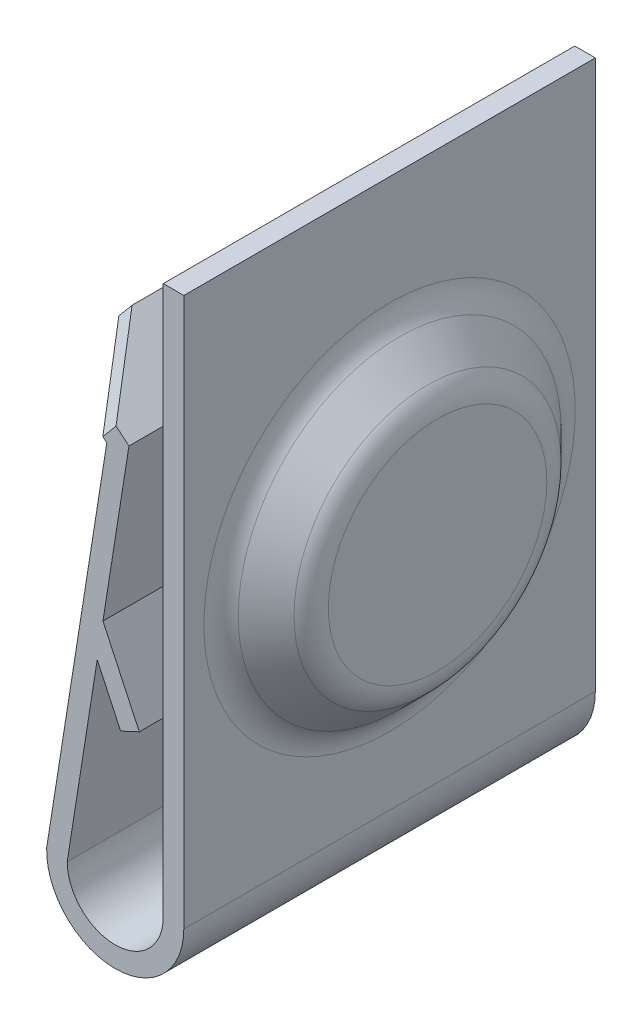
ISO-10303-21;
HEADER;
FILE_DESCRIPTION(('STEP AP214'),'2;1');
FILE_NAME('part.step','',(''),(''),'','','');
FILE_SCHEMA(('AUTOMOTIVE_DESIGN { 1 0 10303 214 1 1 1 1 }'));
ENDSEC;
DATA;
#1=APPLICATION_CONTEXT('core data for automotive mechanical design processes');
#2=APPLICATION_PROTOCOL_DEFINITION('international standard','automotive_design',2000,#1);
#3=PRODUCT_CONTEXT('',#1,'mechanical');
#4=PRODUCT('Part','Part','',(#3));
#5=PRODUCT_RELATED_PRODUCT_CATEGORY('part','',(#4));
#6=PRODUCT_DEFINITION_FORMATION('','',#4);
#7=PRODUCT_DEFINITION_CONTEXT('part definition',#1,'design');
#8=PRODUCT_DEFINITION('design','',#6,#7);
#9=PRODUCT_DEFINITION_SHAPE('','',#8);
#10=(LENGTH_UNIT() NAMED_UNIT(*) SI_UNIT(.MILLI.,.METRE.));
#11=(NAMED_UNIT(*) PLANE_ANGLE_UNIT() SI_UNIT($,.RADIAN.));
#12=(NAMED_UNIT(*) SI_UNIT($,.STERADIAN.) SOLID_ANGLE_UNIT());
#13=UNCERTAINTY_MEASURE_WITH_UNIT(LENGTH_MEASURE(1.E-05),#10,'distance_accuracy_value','');
#14=(GEOMETRIC_REPRESENTATION_CONTEXT(3) GLOBAL_UNCERTAINTY_ASSIGNED_CONTEXT((#13)) GLOBAL_UNIT_ASSIGNED_CONTEXT((#10,
#11,#12)) REPRESENTATION_CONTEXT('',''));
#15=CARTESIAN_POINT('',(0.,0.,0.));
#16=DIRECTION('',(0.,0.,1.));
#17=DIRECTION('',(1.,0.,0.));
#18=AXIS2_PLACEMENT_3D('',#15,#16,#17);
#19=CARTESIAN_POINT('',(-0.133513513513514,0.0210810810810812,6.));
#20=DIRECTION('',(-0.987762965329069,0.155962573473011,0.));
#21=DIRECTION('',(-0.155962573473011,-0.987762965329069,0.));
#22=AXIS2_PLACEMENT_3D('',#19,#20,#21);
#23=PLANE('',#22);
#24=DIRECTION('',(0.,0.,1.));
#25=VECTOR('',#24,1.);
#26=CARTESIAN_POINT('',(-0.962606384425692,-5.22984043469605,5.));
#27=LINE('',#26,#25);
#28=CARTESIAN_POINT('',(-0.962606384425692,-5.22984043469605,5.));
#29=VERTEX_POINT('',#28);
#30=CARTESIAN_POINT('',(-0.962606384425692,-5.22984043469605,6.));
#31=VERTEX_POINT('',#30);
#32=EDGE_CURVE('E203',#29,#31,#27,.T.);
#33=ORIENTED_EDGE('',*,*,#32,.T.);
#34=DIRECTION('',(0.155962573473011,0.987762965329069,0.));
#35=VECTOR('',#34,1.);
#36=CARTESIAN_POINT('',(-0.133513513513514,0.0210810810810812,6.));
#37=LINE('',#36,#35);
#38=CARTESIAN_POINT('',(-1.4,-8.,6.));
#39=VERTEX_POINT('',#38);
#40=EDGE_CURVE('E295',#39,#31,#37,.T.);
#41=ORIENTED_EDGE('',*,*,#40,.F.);
#42=DIRECTION('',(0.,0.,-1.));
#43=VECTOR('',#42,1.);
#44=CARTESIAN_POINT('',(-1.4,-8.,6.));
#45=LINE('',#44,#43);
#46=CARTESIAN_POINT('',(-1.4,-8.,0.));
#47=VERTEX_POINT('',#46);
#48=EDGE_CURVE('E360',#39,#47,#45,.T.);
#49=ORIENTED_EDGE('',*,*,#48,.T.);
#50=DIRECTION('',(0.155962573473011,0.987762965329069,0.));
#51=VECTOR('',#50,1.);
#52=CARTESIAN_POINT('',(-0.133513513513514,0.0210810810810812,0.));
#53=LINE('',#52,#51);
#54=CARTESIAN_POINT('',(-0.962606384425691,-5.22984043469604,0.));
#55=VERTEX_POINT('',#54);
#56=EDGE_CURVE('E329',#47,#55,#53,.T.);
#57=ORIENTED_EDGE('',*,*,#56,.T.);
#58=DIRECTION('',(0.,0.,-1.));
#59=VECTOR('',#58,1.);
#60=CARTESIAN_POINT('',(-0.962606384425691,-5.22984043469604,1.));
#61=LINE('',#60,#59);
#62=CARTESIAN_POINT('',(-0.962606384425691,-5.22984043469604,1.));
#63=VERTEX_POINT('',#62);
#64=EDGE_CURVE('E263',#63,#55,#61,.T.);
#65=ORIENTED_EDGE('',*,*,#64,.F.);
#66=DIRECTION('',(0.155962573473011,0.987762965329069,0.));
#67=VECTOR('',#66,1.);
#68=CARTESIAN_POINT('',(-0.133513513513514,0.0210810810810812,1.));
#69=LINE('',#68,#67);
#70=CARTESIAN_POINT('',(-0.878934414070741,-4.69991795578136,1.));
#71=VERTEX_POINT('',#70);
#72=EDGE_CURVE('E73',#63,#71,#69,.T.);
#73=ORIENTED_EDGE('',*,*,#72,.T.);
#74=DIRECTION('',(0.,0.,-1.));
#75=VECTOR('',#74,1.);
#76=CARTESIAN_POINT('',(-0.87893441407074,-4.69991795578136,1.));
#77=LINE('',#76,#75);
#78=CARTESIAN_POINT('',(-0.87893441407074,-4.69991795578136,0.));
#79=VERTEX_POINT('',#78);
#80=EDGE_CURVE('E267',#71,#79,#77,.T.);
#81=ORIENTED_EDGE('',*,*,#80,.T.);
#82=CARTESIAN_POINT('',(-0.5,-2.3,0.));
#83=VERTEX_POINT('',#82);
#84=EDGE_CURVE('E328',#79,#83,#53,.T.);
#85=ORIENTED_EDGE('',*,*,#84,.T.);
#86=DIRECTION('',(0.,0.,-1.));
#87=VECTOR('',#86,1.);
#88=CARTESIAN_POINT('',(-0.5,-2.3,6.));
#89=LINE('',#88,#87);
#90=CARTESIAN_POINT('',(-0.5,-2.3,6.));
#91=VERTEX_POINT('',#90);
#92=EDGE_CURVE('E356',#91,#83,#89,.T.);
#93=ORIENTED_EDGE('',*,*,#92,.F.);
#94=CARTESIAN_POINT('',(-0.87893441407074,-4.69991795578136,6.));
#95=VERTEX_POINT('',#94);
#96=EDGE_CURVE('E294',#95,#91,#37,.T.);
#97=ORIENTED_EDGE('',*,*,#96,.F.);
#98=DIRECTION('',(0.,0.,1.));
#99=VECTOR('',#98,1.);
#100=CARTESIAN_POINT('',(-0.87893441407074,-4.69991795578136,5.));
#101=LINE('',#100,#99);
#102=CARTESIAN_POINT('',(-0.87893441407074,-4.69991795578136,5.));
#103=VERTEX_POINT('',#102);
#104=EDGE_CURVE('E211',#103,#95,#101,.T.);
#105=ORIENTED_EDGE('',*,*,#104,.F.);
#106=DIRECTION('',(-0.155962573473011,-0.987762965329069,0.));
#107=VECTOR('',#106,1.);
#108=CARTESIAN_POINT('',(-0.133513513513514,0.0210810810810812,5.));
#109=LINE('',#108,#107);
#110=EDGE_CURVE('E192',#103,#29,#109,.T.);
#111=ORIENTED_EDGE('',*,*,#110,.T.);
#112=EDGE_LOOP('',(#33,#41,#49,#57,#65,#73,#81,#85,#93,#97,#105,#111));
#113=FACE_BOUND('',#112,.T.);
#114=ADVANCED_FACE('F49',(#113),#23,.F.);
#115=CARTESIAN_POINT('',(-0.699999999999999,-8.,6.));
#116=DIRECTION('',(0.,0.,-1.));
#117=DIRECTION('',(-1.,0.,0.));
#118=AXIS2_PLACEMENT_3D('',#115,#116,#117);
#119=CYLINDRICAL_SURFACE('',#118,0.999999999999999);
#120=CARTESIAN_POINT('',(-0.699999999999999,-8.,0.));
#121=DIRECTION('',(0.,0.,1.));
#122=DIRECTION('',(1.,0.,0.));
#123=AXIS2_PLACEMENT_3D('',#120,#121,#122);
#124=CIRCLE('',#123,0.999999999999999);
#125=CARTESIAN_POINT('',(0.3,-8.,0.));
#126=VERTEX_POINT('',#125);
#127=CARTESIAN_POINT('',(-1.69967183658794,-7.97438322555649,0.));
#128=VERTEX_POINT('',#127);
#129=EDGE_CURVE('E274',#126,#128,#124,.F.);
#130=ORIENTED_EDGE('',*,*,#129,.F.);
#131=DIRECTION('',(0.,0.,-1.));
#132=VECTOR('',#131,1.);
#133=CARTESIAN_POINT('',(0.3,-8.,6.));
#134=LINE('',#133,#132);
#135=CARTESIAN_POINT('',(0.3,-8.,6.));
#136=VERTEX_POINT('',#135);
#137=EDGE_CURVE('E374',#136,#126,#134,.T.);
#138=ORIENTED_EDGE('',*,*,#137,.F.);
#139=CARTESIAN_POINT('',(-0.699999999999999,-8.,6.));
#140=DIRECTION('',(0.,0.,1.));
#141=DIRECTION('',(1.,0.,0.));
#142=AXIS2_PLACEMENT_3D('',#139,#140,#141);
#143=CIRCLE('',#142,0.999999999999999);
#144=CARTESIAN_POINT('',(-1.69967183658794,-7.97438322555649,6.));
#145=VERTEX_POINT('',#144);
#146=EDGE_CURVE('E275',#136,#145,#143,.F.);
#147=ORIENTED_EDGE('',*,*,#146,.T.);
#148=DIRECTION('',(0.,0.,-1.));
#149=VECTOR('',#148,1.);
#150=CARTESIAN_POINT('',(-1.69967183658794,-7.97438322555649,6.));
#151=LINE('',#150,#149);
#152=EDGE_CURVE('E310',#145,#128,#151,.T.);
#153=ORIENTED_EDGE('',*,*,#152,.T.);
#154=EDGE_LOOP('',(#130,#138,#147,#153));
#155=FACE_BOUND('',#154,.T.);
#156=ADVANCED_FACE('F426',(#155),#119,.T.);
#157=CARTESIAN_POINT('',(0.3,0.,6.));
#158=DIRECTION('',(1.,0.,0.));
#159=DIRECTION('',(0.,0.,-1.));
#160=AXIS2_PLACEMENT_3D('',#157,#158,#159);
#161=PLANE('',#160);
#162=CARTESIAN_POINT('',(0.3,-4.3,3.));
#163=DIRECTION('',(1.,0.,0.));
#164=DIRECTION('',(0.,0.,-1.));
#165=AXIS2_PLACEMENT_3D('',#162,#163,#164);
#166=CIRCLE('',#165,2.70710678118656);
#167=CARTESIAN_POINT('',(0.3,-4.3,0.292893218813443));
#168=VERTEX_POINT('',#167);
#169=EDGE_CURVE('E403',#168,#168,#166,.F.);
#170=ORIENTED_EDGE('',*,*,#169,.T.);
#171=EDGE_LOOP('',(#170));
#172=FACE_BOUND('',#171,.T.);
#173=DIRECTION('',(0.,-1.,0.));
#174=VECTOR('',#173,1.);
#175=CARTESIAN_POINT('',(0.3,0.,0.));
#176=LINE('',#175,#174);
#177=CARTESIAN_POINT('',(0.3,0.,0.));
#178=VERTEX_POINT('',#177);
#179=EDGE_CURVE('E314',#178,#126,#176,.T.);
#180=ORIENTED_EDGE('',*,*,#179,.F.);
#181=DIRECTION('',(0.,0.,-1.));
#182=VECTOR('',#181,1.);
#183=CARTESIAN_POINT('',(0.3,0.,6.));
#184=LINE('',#183,#182);
#185=CARTESIAN_POINT('',(0.3,0.,6.));
#186=VERTEX_POINT('',#185);
#187=EDGE_CURVE('E371',#186,#178,#184,.T.);
#188=ORIENTED_EDGE('',*,*,#187,.F.);
#189=DIRECTION('',(0.,-1.,0.));
#190=VECTOR('',#189,1.);
#191=CARTESIAN_POINT('',(0.3,0.,6.));
#192=LINE('',#191,#190);
#193=EDGE_CURVE('E279',#186,#136,#192,.T.);
#194=ORIENTED_EDGE('',*,*,#193,.T.);
#195=ORIENTED_EDGE('',*,*,#137,.T.);
#196=EDGE_LOOP('',(#180,#188,#194,#195));
#197=FACE_BOUND('',#196,.T.);
#198=ADVANCED_FACE('F422',(#172,#197),#161,.T.);
#199=CARTESIAN_POINT('',(0.,0.,6.));
#200=DIRECTION('',(0.,1.,0.));
#201=DIRECTION('',(0.,0.,1.));
#202=AXIS2_PLACEMENT_3D('',#199,#200,#201);
#203=PLANE('',#202);
#204=DIRECTION('',(1.,0.,0.));
#205=VECTOR('',#204,1.);
#206=CARTESIAN_POINT('',(0.,0.,0.));
#207=LINE('',#206,#205);
#208=CARTESIAN_POINT('',(0.,0.,0.));
#209=VERTEX_POINT('',#208);
#210=EDGE_CURVE('E318',#209,#178,#207,.T.);
#211=ORIENTED_EDGE('',*,*,#210,.F.);
#212=DIRECTION('',(0.,0.,-1.));
#213=VECTOR('',#212,1.);
#214=CARTESIAN_POINT('',(0.,0.,6.));
#215=LINE('',#214,#213);
#216=CARTESIAN_POINT('',(0.,0.,6.));
#217=VERTEX_POINT('',#216);
#218=EDGE_CURVE('E368',#217,#209,#215,.T.);
#219=ORIENTED_EDGE('',*,*,#218,.F.);
#220=DIRECTION('',(1.,0.,0.));
#221=VECTOR('',#220,1.);
#222=CARTESIAN_POINT('',(0.,0.,6.));
#223=LINE('',#222,#221);
#224=EDGE_CURVE('E284',#217,#186,#223,.T.);
#225=ORIENTED_EDGE('',*,*,#224,.T.);
#226=ORIENTED_EDGE('',*,*,#187,.T.);
#227=EDGE_LOOP('',(#211,#219,#225,#226));
#228=FACE_BOUND('',#227,.T.);
#229=ADVANCED_FACE('F425',(#228),#203,.T.);
#230=CARTESIAN_POINT('',(0.,0.,6.));
#231=DIRECTION('',(1.,0.,0.));
#232=DIRECTION('',(0.,1.,0.));
#233=AXIS2_PLACEMENT_3D('',#230,#231,#232);
#234=PLANE('',#233);
#235=DIRECTION('',(0.,-1.,0.));
#236=VECTOR('',#235,1.);
#237=CARTESIAN_POINT('',(0.,0.,0.));
#238=LINE('',#237,#236);
#239=CARTESIAN_POINT('',(0.,-8.,0.));
#240=VERTEX_POINT('',#239);
#241=EDGE_CURVE('E322',#209,#240,#238,.T.);
#242=ORIENTED_EDGE('',*,*,#241,.T.);
#243=DIRECTION('',(0.,0.,-1.));
#244=VECTOR('',#243,1.);
#245=CARTESIAN_POINT('',(0.,-8.,6.));
#246=LINE('',#245,#244);
#247=CARTESIAN_POINT('',(0.,-8.,6.));
#248=VERTEX_POINT('',#247);
#249=EDGE_CURVE('E364',#248,#240,#246,.T.);
#250=ORIENTED_EDGE('',*,*,#249,.F.);
#251=DIRECTION('',(0.,-1.,0.));
#252=VECTOR('',#251,1.);
#253=CARTESIAN_POINT('',(0.,0.,6.));
#254=LINE('',#253,#252);
#255=EDGE_CURVE('E288',#217,#248,#254,.T.);
#256=ORIENTED_EDGE('',*,*,#255,.F.);
#257=ORIENTED_EDGE('',*,*,#218,.T.);
#258=EDGE_LOOP('',(#242,#250,#256,#257));
#259=FACE_BOUND('',#258,.T.);
#260=ADVANCED_FACE('F491',(#259),#234,.F.);
#261=CARTESIAN_POINT('',(-0.7,-8.,6.));
#262=DIRECTION('',(0.,0.,-1.));
#263=DIRECTION('',(-1.,0.,0.));
#264=AXIS2_PLACEMENT_3D('',#261,#262,#263);
#265=CYLINDRICAL_SURFACE('',#264,0.7);
#266=CARTESIAN_POINT('',(-0.7,-8.,0.));
#267=DIRECTION('',(0.,0.,1.));
#268=DIRECTION('',(1.,0.,0.));
#269=AXIS2_PLACEMENT_3D('',#266,#267,#268);
#270=CIRCLE('',#269,0.7);
#271=EDGE_CURVE('E325',#240,#47,#270,.F.);
#272=ORIENTED_EDGE('',*,*,#271,.T.);
#273=ORIENTED_EDGE('',*,*,#48,.F.);
#274=CARTESIAN_POINT('',(-0.7,-8.,6.));
#275=DIRECTION('',(0.,0.,1.));
#276=DIRECTION('',(1.,0.,0.));
#277=AXIS2_PLACEMENT_3D('',#274,#275,#276);
#278=CIRCLE('',#277,0.7);
#279=EDGE_CURVE('E291',#248,#39,#278,.F.);
#280=ORIENTED_EDGE('',*,*,#279,.F.);
#281=ORIENTED_EDGE('',*,*,#249,.T.);
#282=EDGE_LOOP('',(#272,#273,#280,#281));
#283=FACE_BOUND('',#282,.T.);
#284=ADVANCED_FACE('F489',(#283),#265,.F.);
#285=CARTESIAN_POINT('',(-1.33869031443741,-1.59693780244029,6.));
#286=DIRECTION('',(-0.642421554244944,-0.766351451125077,0.));
#287=DIRECTION('',(0.766351451125077,-0.642421554244944,0.));
#288=AXIS2_PLACEMENT_3D('',#285,#286,#287);
#289=PLANE('',#288);
#290=DIRECTION('',(-0.766351451125077,0.642421554244944,0.));
#291=VECTOR('',#290,1.);
#292=CARTESIAN_POINT('',(-1.33869031443741,-1.59693780244029,0.));
#293=LINE('',#292,#291);
#294=CARTESIAN_POINT('',(-0.687976990766372,-2.14242155424494,0.));
#295=VERTEX_POINT('',#294);
#296=EDGE_CURVE('E332',#83,#295,#293,.T.);
#297=ORIENTED_EDGE('',*,*,#296,.T.);
#298=DIRECTION('',(0.541892307862694,-0.454260637387002,-0.707106781186546));
#299=VECTOR('',#298,1.);
#300=CARTESIAN_POINT('',(-1.45432844189145,-1.5,1.));
#301=LINE('',#300,#299);
#302=CARTESIAN_POINT('',(-1.45432844189145,-1.5,1.));
#303=VERTEX_POINT('',#302);
#304=EDGE_CURVE('E396',#295,#303,#301,.F.);
#305=ORIENTED_EDGE('',*,*,#304,.T.);
#306=DIRECTION('',(0.,0.,-1.));
#307=VECTOR('',#306,1.);
#308=CARTESIAN_POINT('',(-1.45432844189145,-1.5,6.));
#309=LINE('',#308,#307);
#310=CARTESIAN_POINT('',(-1.45432844189145,-1.5,5.));
#311=VERTEX_POINT('',#310);
#312=EDGE_CURVE('E352',#311,#303,#309,.T.);
#313=ORIENTED_EDGE('',*,*,#312,.F.);
#314=DIRECTION('',(0.541892307862692,-0.454260637387001,0.707106781186549));
#315=VECTOR('',#314,1.);
#316=CARTESIAN_POINT('',(-0.687976990766374,-2.14242155424494,6.));
#317=LINE('',#316,#315);
#318=CARTESIAN_POINT('',(-0.687976990766374,-2.14242155424494,6.));
#319=VERTEX_POINT('',#318);
#320=EDGE_CURVE('E393',#311,#319,#317,.T.);
#321=ORIENTED_EDGE('',*,*,#320,.T.);
#322=DIRECTION('',(-0.766351451125077,0.642421554244944,0.));
#323=VECTOR('',#322,1.);
#324=CARTESIAN_POINT('',(-1.33869031443741,-1.59693780244029,6.));
#325=LINE('',#324,#323);
#326=EDGE_CURVE('E298',#91,#319,#325,.T.);
#327=ORIENTED_EDGE('',*,*,#326,.F.);
#328=ORIENTED_EDGE('',*,*,#92,.T.);
#329=EDGE_LOOP('',(#297,#305,#313,#321,#327,#328));
#330=FACE_BOUND('',#329,.T.);
#331=ADVANCED_FACE('F459',(#330),#289,.F.);
#332=CARTESIAN_POINT('',(-0.115638127454037,0.0969378024402965,6.));
#333=DIRECTION('',(0.766351451125077,-0.642421554244943,0.));
#334=DIRECTION('',(0.642421554244943,0.766351451125077,0.));
#335=AXIS2_PLACEMENT_3D('',#332,#333,#334);
#336=PLANE('',#335);
#337=ORIENTED_EDGE('',*,*,#312,.T.);
#338=DIRECTION('',(-0.642421554244943,-0.766351451125077,0.));
#339=VECTOR('',#338,1.);
#340=CARTESIAN_POINT('',(-0.115638127454037,0.0969378024402965,1.));
#341=LINE('',#340,#339);
#342=CARTESIAN_POINT('',(-1.64705490816493,-1.72990543533752,1.));
#343=VERTEX_POINT('',#342);
#344=EDGE_CURVE('E380',#303,#343,#341,.T.);
#345=ORIENTED_EDGE('',*,*,#344,.T.);
#346=DIRECTION('',(0.,0.,-1.));
#347=VECTOR('',#346,1.);
#348=CARTESIAN_POINT('',(-1.64705490816493,-1.72990543533752,6.));
#349=LINE('',#348,#347);
#350=CARTESIAN_POINT('',(-1.64705490816493,-1.72990543533752,5.));
#351=VERTEX_POINT('',#350);
#352=EDGE_CURVE('E348',#351,#343,#349,.T.);
#353=ORIENTED_EDGE('',*,*,#352,.F.);
#354=DIRECTION('',(0.642421554244943,0.766351451125077,0.));
#355=VECTOR('',#354,1.);
#356=CARTESIAN_POINT('',(-1.45432844189145,-1.5,5.));
#357=LINE('',#356,#355);
#358=EDGE_CURVE('E377',#351,#311,#357,.T.);
#359=ORIENTED_EDGE('',*,*,#358,.T.);
#360=EDGE_LOOP('',(#337,#345,#353,#359));
#361=FACE_BOUND('',#360,.T.);
#362=ADVANCED_FACE('F462',(#361),#336,.F.);
#363=CARTESIAN_POINT('',(-1.5314167807109,-1.82684323777782,6.));
#364=DIRECTION('',(-0.642421554244943,-0.766351451125077,0.));
#365=DIRECTION('',(0.766351451125077,-0.642421554244944,0.));
#366=AXIS2_PLACEMENT_3D('',#363,#364,#365);
#367=PLANE('',#366);
#368=ORIENTED_EDGE('',*,*,#352,.T.);
#369=DIRECTION('',(-0.541892307862694,0.454260637387002,0.707106781186546));
#370=VECTOR('',#369,1.);
#371=CARTESIAN_POINT('',(-3.50511447225061,-0.17232045094531,3.42455280975571));
#372=LINE('',#371,#370);
#373=CARTESIAN_POINT('',(-0.880703457039855,-2.37232698958247,0.));
#374=VERTEX_POINT('',#373);
#375=EDGE_CURVE('E387',#343,#374,#372,.F.);
#376=ORIENTED_EDGE('',*,*,#375,.T.);
#377=DIRECTION('',(-0.766351451125077,0.642421554244944,0.));
#378=VECTOR('',#377,1.);
#379=CARTESIAN_POINT('',(-1.5314167807109,-1.82684323777782,0.));
#380=LINE('',#379,#378);
#381=CARTESIAN_POINT('',(-0.822800703144863,-2.42086604708366,0.));
#382=VERTEX_POINT('',#381);
#383=EDGE_CURVE('E336',#382,#374,#380,.T.);
#384=ORIENTED_EDGE('',*,*,#383,.F.);
#385=DIRECTION('',(0.,0.,-1.));
#386=VECTOR('',#385,1.);
#387=CARTESIAN_POINT('',(-0.822800703144863,-2.42086604708366,6.));
#388=LINE('',#387,#386);
#389=CARTESIAN_POINT('',(-0.822800703144863,-2.42086604708366,6.));
#390=VERTEX_POINT('',#389);
#391=EDGE_CURVE('E345',#390,#382,#388,.T.);
#392=ORIENTED_EDGE('',*,*,#391,.F.);
#393=DIRECTION('',(-0.766351451125077,0.642421554244944,0.));
#394=VECTOR('',#393,1.);
#395=CARTESIAN_POINT('',(-1.5314167807109,-1.82684323777782,6.));
#396=LINE('',#395,#394);
#397=CARTESIAN_POINT('',(-0.880703457039856,-2.37232698958246,6.));
#398=VERTEX_POINT('',#397);
#399=EDGE_CURVE('E302',#390,#398,#396,.T.);
#400=ORIENTED_EDGE('',*,*,#399,.T.);
#401=DIRECTION('',(-0.541892307862692,0.454260637387,-0.707106781186549));
#402=VECTOR('',#401,1.);
#403=CARTESIAN_POINT('',(-1.20606011887538,-2.09958511368014,5.57544719024429));
#404=LINE('',#403,#402);
#405=EDGE_CURVE('E384',#398,#351,#404,.T.);
#406=ORIENTED_EDGE('',*,*,#405,.T.);
#407=EDGE_LOOP('',(#368,#376,#384,#392,#400,#406));
#408=FACE_BOUND('',#407,.T.);
#409=ADVANCED_FACE('F450',(#408),#367,.T.);
#410=CARTESIAN_POINT('',(-0.429842403112235,0.0678698531229845,6.));
#411=DIRECTION('',(-0.987762965329069,0.155962573473011,0.));
#412=DIRECTION('',(-0.155962573473011,-0.987762965329069,0.));
#413=AXIS2_PLACEMENT_3D('',#410,#411,#412);
#414=PLANE('',#413);
#415=DIRECTION('',(0.155962573473011,0.987762965329069,0.));
#416=VECTOR('',#415,1.);
#417=CARTESIAN_POINT('',(-0.429842403112235,0.0678698531229845,0.));
#418=LINE('',#417,#416);
#419=EDGE_CURVE('E280',#128,#382,#418,.T.);
#420=ORIENTED_EDGE('',*,*,#419,.F.);
#421=ORIENTED_EDGE('',*,*,#152,.F.);
#422=DIRECTION('',(0.155962573473011,0.987762965329069,0.));
#423=VECTOR('',#422,1.);
#424=CARTESIAN_POINT('',(-0.429842403112235,0.0678698531229845,6.));
#425=LINE('',#424,#423);
#426=EDGE_CURVE('E306',#145,#390,#425,.T.);
#427=ORIENTED_EDGE('',*,*,#426,.T.);
#428=ORIENTED_EDGE('',*,*,#391,.T.);
#429=EDGE_LOOP('',(#420,#421,#427,#428));
#430=FACE_BOUND('',#429,.T.);
#431=ADVANCED_FACE('F447',(#430),#414,.T.);
#432=CARTESIAN_POINT('',(0.,0.,6.));
#433=DIRECTION('',(0.,0.,1.));
#434=DIRECTION('',(1.,0.,0.));
#435=AXIS2_PLACEMENT_3D('',#432,#433,#434);
#436=PLANE('',#435);
#437=ORIENTED_EDGE('',*,*,#326,.T.);
#438=DIRECTION('',(-0.642421554244943,-0.766351451125077,0.));
#439=VECTOR('',#438,1.);
#440=CARTESIAN_POINT('',(-0.880703457039857,-2.37232698958246,6.));
#441=LINE('',#440,#439);
#442=EDGE_CURVE('E399',#319,#398,#441,.T.);
#443=ORIENTED_EDGE('',*,*,#442,.T.);
#444=ORIENTED_EDGE('',*,*,#399,.F.);
#445=ORIENTED_EDGE('',*,*,#426,.F.);
#446=ORIENTED_EDGE('',*,*,#146,.F.);
#447=ORIENTED_EDGE('',*,*,#193,.F.);
#448=ORIENTED_EDGE('',*,*,#224,.F.);
#449=ORIENTED_EDGE('',*,*,#255,.T.);
#450=ORIENTED_EDGE('',*,*,#279,.T.);
#451=ORIENTED_EDGE('',*,*,#40,.T.);
#452=DIRECTION('',(-0.423051207201736,0.906105775329323,0.));
#453=VECTOR('',#452,1.);
#454=CARTESIAN_POINT('',(-2.79507672997063,-1.30499177582859,6.));
#455=LINE('',#454,#453);
#456=CARTESIAN_POINT('',(-0.621188887725109,-5.96110029235048,6.));
#457=VERTEX_POINT('',#456);
#458=EDGE_CURVE('E206',#457,#31,#455,.T.);
#459=ORIENTED_EDGE('',*,*,#458,.F.);
#460=DIRECTION('',(-0.906105775329324,-0.423051207201735,0.));
#461=VECTOR('',#460,1.);
#462=CARTESIAN_POINT('',(2.17388784224552,-4.65610851652189,6.));
#463=LINE('',#462,#461);
#464=CARTESIAN_POINT('',(-0.349357155126313,-5.83418493018996,6.));
#465=VERTEX_POINT('',#464);
#466=EDGE_CURVE('E200',#465,#457,#463,.T.);
#467=ORIENTED_EDGE('',*,*,#466,.F.);
#468=DIRECTION('',(0.423051207201736,-0.906105775329323,0.));
#469=VECTOR('',#468,1.);
#470=CARTESIAN_POINT('',(-2.52324499737183,-1.17807641366807,6.));
#471=LINE('',#470,#469);
#472=EDGE_CURVE('E65',#95,#465,#471,.T.);
#473=ORIENTED_EDGE('',*,*,#472,.F.);
#474=ORIENTED_EDGE('',*,*,#96,.T.);
#475=EDGE_LOOP('',(#437,#443,#444,#445,#446,#447,#448,#449,#450,#451,#459,#467,#473,#474));
#476=FACE_BOUND('',#475,.T.);
#477=ADVANCED_FACE('F439',(#476),#436,.T.);
#478=CARTESIAN_POINT('',(0.,0.,0.));
#479=DIRECTION('',(0.,0.,1.));
#480=DIRECTION('',(1.,0.,0.));
#481=AXIS2_PLACEMENT_3D('',#478,#479,#480);
#482=PLANE('',#481);
#483=ORIENTED_EDGE('',*,*,#383,.T.);
#484=DIRECTION('',(0.642421554244943,0.766351451125077,0.));
#485=VECTOR('',#484,1.);
#486=CARTESIAN_POINT('',(0.650713323671042,-0.545483751804649,0.));
#487=LINE('',#486,#485);
#488=EDGE_CURVE('E390',#374,#295,#487,.T.);
#489=ORIENTED_EDGE('',*,*,#488,.T.);
#490=ORIENTED_EDGE('',*,*,#296,.F.);
#491=ORIENTED_EDGE('',*,*,#84,.F.);
#492=DIRECTION('',(-0.423051207201736,0.906105775329323,0.));
#493=VECTOR('',#492,1.);
#494=CARTESIAN_POINT('',(-2.52324499737183,-1.17807641366807,0.));
#495=LINE('',#494,#493);
#496=CARTESIAN_POINT('',(-0.349357155126312,-5.83418493018996,0.));
#497=VERTEX_POINT('',#496);
#498=EDGE_CURVE('E254',#497,#79,#495,.T.);
#499=ORIENTED_EDGE('',*,*,#498,.F.);
#500=DIRECTION('',(0.906105775329324,0.423051207201735,0.));
#501=VECTOR('',#500,1.);
#502=CARTESIAN_POINT('',(2.17388784224552,-4.65610851652189,0.));
#503=LINE('',#502,#501);
#504=CARTESIAN_POINT('',(-0.621188887725109,-5.96110029235048,0.));
#505=VERTEX_POINT('',#504);
#506=EDGE_CURVE('E210',#505,#497,#503,.T.);
#507=ORIENTED_EDGE('',*,*,#506,.F.);
#508=DIRECTION('',(0.423051207201736,-0.906105775329323,0.));
#509=VECTOR('',#508,1.);
#510=CARTESIAN_POINT('',(-2.79507672997063,-1.30499177582859,0.));
#511=LINE('',#510,#509);
#512=EDGE_CURVE('E242',#55,#505,#511,.T.);
#513=ORIENTED_EDGE('',*,*,#512,.F.);
#514=ORIENTED_EDGE('',*,*,#56,.F.);
#515=ORIENTED_EDGE('',*,*,#271,.F.);
#516=ORIENTED_EDGE('',*,*,#241,.F.);
#517=ORIENTED_EDGE('',*,*,#210,.T.);
#518=ORIENTED_EDGE('',*,*,#179,.T.);
#519=ORIENTED_EDGE('',*,*,#129,.T.);
#520=ORIENTED_EDGE('',*,*,#419,.T.);
#521=EDGE_LOOP('',(#483,#489,#490,#491,#499,#507,#513,#514,#515,#516,#517,#518,#519,#520));
#522=FACE_BOUND('',#521,.T.);
#523=ADVANCED_FACE('F434',(#522),#482,.F.);
#524=CARTESIAN_POINT('',(-0.115638127454037,0.0969378024402965,1.));
#525=DIRECTION('',(0.541892307862692,-0.454260637387,0.707106781186549));
#526=DIRECTION('',(-0.642421554244943,-0.766351451125077,0.));
#527=AXIS2_PLACEMENT_3D('',#524,#525,#526);
#528=PLANE('',#527);
#529=ORIENTED_EDGE('',*,*,#304,.F.);
#530=ORIENTED_EDGE('',*,*,#488,.F.);
#531=ORIENTED_EDGE('',*,*,#375,.F.);
#532=ORIENTED_EDGE('',*,*,#344,.F.);
#533=EDGE_LOOP('',(#529,#530,#531,#532));
#534=FACE_BOUND('',#533,.T.);
#535=ADVANCED_FACE('F455',(#534),#528,.F.);
#536=CARTESIAN_POINT('',(0.650713323671041,-0.545483751804648,6.));
#537=DIRECTION('',(-0.541892307862694,0.454260637387002,0.707106781186546));
#538=DIRECTION('',(0.642421554244943,0.766351451125077,0.));
#539=AXIS2_PLACEMENT_3D('',#536,#537,#538);
#540=PLANE('',#539);
#541=ORIENTED_EDGE('',*,*,#320,.F.);
#542=ORIENTED_EDGE('',*,*,#358,.F.);
#543=ORIENTED_EDGE('',*,*,#405,.F.);
#544=ORIENTED_EDGE('',*,*,#442,.F.);
#545=EDGE_LOOP('',(#541,#542,#543,#544));
#546=FACE_BOUND('',#545,.T.);
#547=ADVANCED_FACE('F466',(#546),#540,.T.);
#548=CARTESIAN_POINT('',(1.,0.,0.));
#549=DIRECTION('',(1.,0.,0.));
#550=DIRECTION('',(0.,0.,-1.));
#551=AXIS2_PLACEMENT_3D('',#548,#549,#550);
#552=PLANE('',#551);
#553=CARTESIAN_POINT('',(1.,-4.3,3.));
#554=DIRECTION('',(1.,0.,0.));
#555=DIRECTION('',(0.,0.,-1.));
#556=AXIS2_PLACEMENT_3D('',#553,#554,#555);
#557=CIRCLE('',#556,1.59289321881347);
#558=CARTESIAN_POINT('',(1.,-4.3,1.40710678118653));
#559=VERTEX_POINT('',#558);
#560=EDGE_CURVE('E11',#559,#559,#557,.T.);
#561=ORIENTED_EDGE('',*,*,#560,.T.);
#562=EDGE_LOOP('',(#561));
#563=FACE_BOUND('',#562,.T.);
#564=ADVANCED_FACE('F520',(#563),#552,.T.);
#565=CARTESIAN_POINT('',(1.30000000000002,-4.3,3.));
#566=DIRECTION('',(-1.,0.,0.));
#567=DIRECTION('',(0.,0.,1.));
#568=AXIS2_PLACEMENT_3D('',#565,#566,#567);
#569=CONICAL_SURFACE('',#568,1.5,0.785398163397443);
#570=CARTESIAN_POINT('',(0.446446609406728,-4.3,3.));
#571=DIRECTION('',(1.,0.,0.));
#572=DIRECTION('',(0.,0.,-1.));
#573=AXIS2_PLACEMENT_3D('',#570,#571,#572);
#574=CIRCLE('',#573,2.35355339059328);
#575=CARTESIAN_POINT('',(0.446446609406728,-4.3,0.646446609406719));
#576=VERTEX_POINT('',#575);
#577=EDGE_CURVE('E58',#576,#576,#574,.T.);
#578=ORIENTED_EDGE('',*,*,#577,.T.);
#579=EDGE_LOOP('',(#578));
#580=FACE_BOUND('',#579,.T.);
#581=CARTESIAN_POINT('',(0.853553390593272,-4.3,3.));
#582=DIRECTION('',(-1.,0.,0.));
#583=DIRECTION('',(0.,0.,1.));
#584=AXIS2_PLACEMENT_3D('',#581,#582,#583);
#585=CIRCLE('',#584,1.94644660940674);
#586=CARTESIAN_POINT('',(0.853553390593272,-4.3,4.94644660940674));
#587=VERTEX_POINT('',#586);
#588=EDGE_CURVE('E407',#587,#587,#585,.T.);
#589=ORIENTED_EDGE('',*,*,#588,.T.);
#590=EDGE_LOOP('',(#589));
#591=FACE_BOUND('',#590,.T.);
#592=ADVANCED_FACE('F414',(#580,#591),#569,.T.);
#593=CARTESIAN_POINT('',(0.8,-4.3,3.));
#594=DIRECTION('',(1.,0.,0.));
#595=DIRECTION('',(0.,0.,-1.));
#596=AXIS2_PLACEMENT_3D('',#593,#594,#595);
#597=TOROIDAL_SURFACE('',#596,2.70710678118656,0.5);
#598=ORIENTED_EDGE('',*,*,#577,.F.);
#599=EDGE_LOOP('',(#598));
#600=FACE_BOUND('',#599,.T.);
#601=ORIENTED_EDGE('',*,*,#169,.F.);
#602=EDGE_LOOP('',(#601));
#603=FACE_BOUND('',#602,.T.);
#604=ADVANCED_FACE('F417',(#600,#603),#597,.F.);
#605=CARTESIAN_POINT('',(0.5,-4.3,3.));
#606=DIRECTION('',(1.,0.,0.));
#607=DIRECTION('',(0.,0.,-1.));
#608=AXIS2_PLACEMENT_3D('',#605,#606,#607);
#609=TOROIDAL_SURFACE('',#608,1.59289321881347,0.5);
#610=ORIENTED_EDGE('',*,*,#588,.F.);
#611=EDGE_LOOP('',(#610));
#612=FACE_BOUND('',#611,.T.);
#613=ORIENTED_EDGE('',*,*,#560,.F.);
#614=EDGE_LOOP('',(#613));
#615=FACE_BOUND('',#614,.T.);
#616=ADVANCED_FACE('F51',(#612,#615),#609,.T.);
#617=CARTESIAN_POINT('',(2.17388784224552,-4.65610851652189,1.));
#618=DIRECTION('',(-0.423051207201735,0.906105775329324,0.));
#619=DIRECTION('',(-0.906105775329324,-0.423051207201735,0.));
#620=AXIS2_PLACEMENT_3D('',#617,#618,#619);
#621=PLANE('',#620);
#622=ORIENTED_EDGE('',*,*,#506,.T.);
#623=DIRECTION('',(0.,0.,-1.));
#624=VECTOR('',#623,1.);
#625=CARTESIAN_POINT('',(-0.349357155126312,-5.83418493018996,1.));
#626=LINE('',#625,#624);
#627=CARTESIAN_POINT('',(-0.349357155126312,-5.83418493018996,1.));
#628=VERTEX_POINT('',#627);
#629=EDGE_CURVE('E270',#628,#497,#626,.T.);
#630=ORIENTED_EDGE('',*,*,#629,.F.);
#631=DIRECTION('',(0.906105775329324,0.423051207201735,0.));
#632=VECTOR('',#631,1.);
#633=CARTESIAN_POINT('',(2.17388784224552,-4.65610851652189,1.));
#634=LINE('',#633,#632);
#635=CARTESIAN_POINT('',(-0.621188887725109,-5.96110029235048,1.));
#636=VERTEX_POINT('',#635);
#637=EDGE_CURVE('E237',#636,#628,#634,.T.);
#638=ORIENTED_EDGE('',*,*,#637,.F.);
#639=DIRECTION('',(0.,0.,-1.));
#640=VECTOR('',#639,1.);
#641=CARTESIAN_POINT('',(-0.621188887725109,-5.96110029235048,1.));
#642=LINE('',#641,#640);
#643=EDGE_CURVE('E250',#636,#505,#642,.T.);
#644=ORIENTED_EDGE('',*,*,#643,.T.);
#645=EDGE_LOOP('',(#622,#630,#638,#644));
#646=FACE_BOUND('',#645,.T.);
#647=ADVANCED_FACE('F479',(#646),#621,.F.);
#648=CARTESIAN_POINT('',(-2.52324499737183,-1.17807641366807,1.));
#649=DIRECTION('',(-0.906105775329323,-0.423051207201736,0.));
#650=DIRECTION('',(0.423051207201736,-0.906105775329323,0.));
#651=AXIS2_PLACEMENT_3D('',#648,#649,#650);
#652=PLANE('',#651);
#653=ORIENTED_EDGE('',*,*,#498,.T.);
#654=ORIENTED_EDGE('',*,*,#80,.F.);
#655=DIRECTION('',(-0.423051207201736,0.906105775329323,0.));
#656=VECTOR('',#655,1.);
#657=CARTESIAN_POINT('',(-2.52324499737183,-1.17807641366807,1.));
#658=LINE('',#657,#656);
#659=EDGE_CURVE('E241',#628,#71,#658,.T.);
#660=ORIENTED_EDGE('',*,*,#659,.F.);
#661=ORIENTED_EDGE('',*,*,#629,.T.);
#662=EDGE_LOOP('',(#653,#654,#660,#661));
#663=FACE_BOUND('',#662,.T.);
#664=ADVANCED_FACE('F475',(#663),#652,.F.);
#665=CARTESIAN_POINT('',(-2.79507672997063,-1.30499177582859,1.));
#666=DIRECTION('',(0.906105775329323,0.423051207201736,0.));
#667=DIRECTION('',(-0.423051207201736,0.906105775329323,0.));
#668=AXIS2_PLACEMENT_3D('',#665,#666,#667);
#669=PLANE('',#668);
#670=ORIENTED_EDGE('',*,*,#512,.T.);
#671=ORIENTED_EDGE('',*,*,#643,.F.);
#672=DIRECTION('',(0.423051207201736,-0.906105775329323,0.));
#673=VECTOR('',#672,1.);
#674=CARTESIAN_POINT('',(-2.79507672997063,-1.30499177582859,1.));
#675=LINE('',#674,#673);
#676=EDGE_CURVE('E247',#63,#636,#675,.T.);
#677=ORIENTED_EDGE('',*,*,#676,.F.);
#678=ORIENTED_EDGE('',*,*,#64,.T.);
#679=EDGE_LOOP('',(#670,#671,#677,#678));
#680=FACE_BOUND('',#679,.T.);
#681=ADVANCED_FACE('F484',(#680),#669,.F.);
#682=CARTESIAN_POINT('',(0.,0.,1.));
#683=DIRECTION('',(0.,0.,1.));
#684=DIRECTION('',(1.,0.,0.));
#685=AXIS2_PLACEMENT_3D('',#682,#683,#684);
#686=PLANE('',#685);
#687=ORIENTED_EDGE('',*,*,#637,.T.);
#688=ORIENTED_EDGE('',*,*,#659,.T.);
#689=ORIENTED_EDGE('',*,*,#72,.F.);
#690=ORIENTED_EDGE('',*,*,#676,.T.);
#691=EDGE_LOOP('',(#687,#688,#689,#690));
#692=FACE_BOUND('',#691,.T.);
#693=ADVANCED_FACE('F530',(#692),#686,.T.);
#694=CARTESIAN_POINT('',(-2.79507672997063,-1.30499177582859,5.));
#695=DIRECTION('',(0.906105775329323,0.423051207201736,0.));
#696=DIRECTION('',(-0.423051207201736,0.906105775329323,0.));
#697=AXIS2_PLACEMENT_3D('',#694,#695,#696);
#698=PLANE('',#697);
#699=ORIENTED_EDGE('',*,*,#458,.T.);
#700=ORIENTED_EDGE('',*,*,#32,.F.);
#701=DIRECTION('',(-0.423051207201736,0.906105775329323,0.));
#702=VECTOR('',#701,1.);
#703=CARTESIAN_POINT('',(-2.79507672997063,-1.30499177582859,5.));
#704=LINE('',#703,#702);
#705=CARTESIAN_POINT('',(-0.621188887725109,-5.96110029235048,5.));
#706=VERTEX_POINT('',#705);
#707=EDGE_CURVE('E188',#706,#29,#704,.T.);
#708=ORIENTED_EDGE('',*,*,#707,.F.);
#709=DIRECTION('',(0.,0.,1.));
#710=VECTOR('',#709,1.);
#711=CARTESIAN_POINT('',(-0.621188887725109,-5.96110029235048,5.));
#712=LINE('',#711,#710);
#713=EDGE_CURVE('E222',#706,#457,#712,.T.);
#714=ORIENTED_EDGE('',*,*,#713,.T.);
#715=EDGE_LOOP('',(#699,#700,#708,#714));
#716=FACE_BOUND('',#715,.T.);
#717=ADVANCED_FACE('F204',(#716),#698,.F.);
#718=CARTESIAN_POINT('',(-2.52324499737183,-1.17807641366807,5.));
#719=DIRECTION('',(-0.906105775329323,-0.423051207201736,0.));
#720=DIRECTION('',(0.423051207201736,-0.906105775329323,0.));
#721=AXIS2_PLACEMENT_3D('',#718,#719,#720);
#722=PLANE('',#721);
#723=ORIENTED_EDGE('',*,*,#472,.T.);
#724=DIRECTION('',(0.,0.,1.));
#725=VECTOR('',#724,1.);
#726=CARTESIAN_POINT('',(-0.349357155126313,-5.83418493018996,5.));
#727=LINE('',#726,#725);
#728=CARTESIAN_POINT('',(-0.349357155126313,-5.83418493018996,5.));
#729=VERTEX_POINT('',#728);
#730=EDGE_CURVE('E231',#729,#465,#727,.T.);
#731=ORIENTED_EDGE('',*,*,#730,.F.);
#732=DIRECTION('',(0.423051207201736,-0.906105775329323,0.));
#733=VECTOR('',#732,1.);
#734=CARTESIAN_POINT('',(-2.52324499737183,-1.17807641366807,5.));
#735=LINE('',#734,#733);
#736=EDGE_CURVE('E215',#103,#729,#735,.T.);
#737=ORIENTED_EDGE('',*,*,#736,.F.);
#738=ORIENTED_EDGE('',*,*,#104,.T.);
#739=EDGE_LOOP('',(#723,#731,#737,#738));
#740=FACE_BOUND('',#739,.T.);
#741=ADVANCED_FACE('F535',(#740),#722,.F.);
#742=CARTESIAN_POINT('',(2.17388784224552,-4.65610851652189,5.));
#743=DIRECTION('',(-0.423051207201735,0.906105775329324,0.));
#744=DIRECTION('',(-0.906105775329324,-0.423051207201735,0.));
#745=AXIS2_PLACEMENT_3D('',#742,#743,#744);
#746=PLANE('',#745);
#747=ORIENTED_EDGE('',*,*,#466,.T.);
#748=ORIENTED_EDGE('',*,*,#713,.F.);
#749=DIRECTION('',(-0.906105775329324,-0.423051207201735,0.));
#750=VECTOR('',#749,1.);
#751=CARTESIAN_POINT('',(2.17388784224552,-4.65610851652189,5.));
#752=LINE('',#751,#750);
#753=EDGE_CURVE('E195',#729,#706,#752,.T.);
#754=ORIENTED_EDGE('',*,*,#753,.F.);
#755=ORIENTED_EDGE('',*,*,#730,.T.);
#756=EDGE_LOOP('',(#747,#748,#754,#755));
#757=FACE_BOUND('',#756,.T.);
#758=ADVANCED_FACE('F538',(#757),#746,.F.);
#759=CARTESIAN_POINT('',(0.,0.,5.));
#760=DIRECTION('',(0.,0.,1.));
#761=DIRECTION('',(1.,0.,0.));
#762=AXIS2_PLACEMENT_3D('',#759,#760,#761);
#763=PLANE('',#762);
#764=ORIENTED_EDGE('',*,*,#707,.T.);
#765=ORIENTED_EDGE('',*,*,#110,.F.);
#766=ORIENTED_EDGE('',*,*,#736,.T.);
#767=ORIENTED_EDGE('',*,*,#753,.T.);
#768=EDGE_LOOP('',(#764,#765,#766,#767));
#769=FACE_BOUND('',#768,.T.);
#770=ADVANCED_FACE('F190',(#769),#763,.F.);
#771=CLOSED_SHELL('',(#114,#156,#198,#229,#260,#284,#331,#362,#409,#431,#477,#523,#535,#547,
#564,#592,#604,#616,#647,#664,#681,#693,#717,#741,#758,#770));
#772=MANIFOLD_SOLID_BREP('B2',#771);
#773=ADVANCED_BREP_SHAPE_REPRESENTATION('',(#18,#772),#14);
#774=SHAPE_DEFINITION_REPRESENTATION(#9,#773);
ENDSEC;
END-ISO-10303-21;
